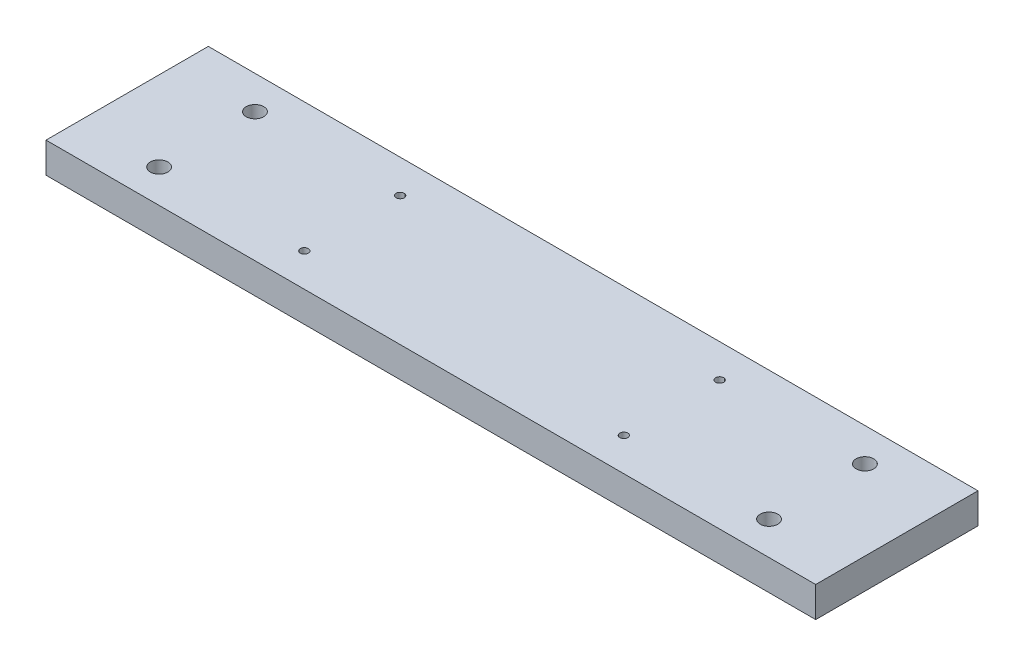
ISO-10303-21;
HEADER;
FILE_DESCRIPTION(('STEP AP214'),'2;1');
FILE_NAME('part.step','',(''),(''),'','','');
FILE_SCHEMA(('AUTOMOTIVE_DESIGN { 1 0 10303 214 1 1 1 1 }'));
ENDSEC;
DATA;
#1=APPLICATION_CONTEXT('core data for automotive mechanical design processes');
#2=APPLICATION_PROTOCOL_DEFINITION('international standard','automotive_design',2000,#1);
#3=PRODUCT_CONTEXT('',#1,'mechanical');
#4=PRODUCT('Part','Part','',(#3));
#5=PRODUCT_RELATED_PRODUCT_CATEGORY('part','',(#4));
#6=PRODUCT_DEFINITION_FORMATION('','',#4);
#7=PRODUCT_DEFINITION_CONTEXT('part definition',#1,'design');
#8=PRODUCT_DEFINITION('design','',#6,#7);
#9=PRODUCT_DEFINITION_SHAPE('','',#8);
#10=(LENGTH_UNIT() NAMED_UNIT(*) SI_UNIT(.MILLI.,.METRE.));
#11=(NAMED_UNIT(*) PLANE_ANGLE_UNIT() SI_UNIT($,.RADIAN.));
#12=(NAMED_UNIT(*) SI_UNIT($,.STERADIAN.) SOLID_ANGLE_UNIT());
#13=UNCERTAINTY_MEASURE_WITH_UNIT(LENGTH_MEASURE(1.E-05),#10,'distance_accuracy_value','');
#14=(GEOMETRIC_REPRESENTATION_CONTEXT(3) GLOBAL_UNCERTAINTY_ASSIGNED_CONTEXT((#13)) GLOBAL_UNIT_ASSIGNED_CONTEXT((#10,
#11,#12)) REPRESENTATION_CONTEXT('',''));
#15=CARTESIAN_POINT('',(0.,0.,0.));
#16=DIRECTION('',(0.,0.,1.));
#17=DIRECTION('',(1.,0.,0.));
#18=AXIS2_PLACEMENT_3D('',#15,#16,#17);
#19=CARTESIAN_POINT('',(120.45,-9.525,-25.4));
#20=DIRECTION('',(1.,0.,0.));
#21=DIRECTION('',(0.,0.,-1.));
#22=AXIS2_PLACEMENT_3D('',#19,#20,#21);
#23=PLANE('',#22);
#24=DIRECTION('',(0.,0.,-1.));
#25=VECTOR('',#24,1.);
#26=CARTESIAN_POINT('',(120.45,0.,-25.4));
#27=LINE('',#26,#25);
#28=CARTESIAN_POINT('',(120.45,0.,25.4));
#29=VERTEX_POINT('',#28);
#30=CARTESIAN_POINT('',(120.45,0.,-25.4));
#31=VERTEX_POINT('',#30);
#32=EDGE_CURVE('E105',#29,#31,#27,.T.);
#33=ORIENTED_EDGE('',*,*,#32,.F.);
#34=DIRECTION('',(0.,1.,0.));
#35=VECTOR('',#34,1.);
#36=CARTESIAN_POINT('',(120.45,-9.525,25.4));
#37=LINE('',#36,#35);
#38=CARTESIAN_POINT('',(120.45,-9.525,25.4));
#39=VERTEX_POINT('',#38);
#40=EDGE_CURVE('E11',#39,#29,#37,.T.);
#41=ORIENTED_EDGE('',*,*,#40,.F.);
#42=DIRECTION('',(0.,0.,-1.));
#43=VECTOR('',#42,1.);
#44=CARTESIAN_POINT('',(120.45,-9.525,-25.4));
#45=LINE('',#44,#43);
#46=CARTESIAN_POINT('',(120.45,-9.525,-25.4));
#47=VERTEX_POINT('',#46);
#48=EDGE_CURVE('E98',#39,#47,#45,.T.);
#49=ORIENTED_EDGE('',*,*,#48,.T.);
#50=DIRECTION('',(0.,1.,0.));
#51=VECTOR('',#50,1.);
#52=CARTESIAN_POINT('',(120.45,-9.525,-25.4));
#53=LINE('',#52,#51);
#54=EDGE_CURVE('E43',#47,#31,#53,.T.);
#55=ORIENTED_EDGE('',*,*,#54,.T.);
#56=EDGE_LOOP('',(#33,#41,#49,#55));
#57=FACE_BOUND('',#56,.T.);
#58=ADVANCED_FACE('F40',(#57),#23,.T.);
#59=CARTESIAN_POINT('',(-120.45,-9.525,25.4));
#60=DIRECTION('',(0.,0.,1.));
#61=DIRECTION('',(1.,0.,0.));
#62=AXIS2_PLACEMENT_3D('',#59,#60,#61);
#63=PLANE('',#62);
#64=DIRECTION('',(1.,0.,0.));
#65=VECTOR('',#64,1.);
#66=CARTESIAN_POINT('',(-120.45,0.,25.4));
#67=LINE('',#66,#65);
#68=CARTESIAN_POINT('',(-120.45,0.,25.4));
#69=VERTEX_POINT('',#68);
#70=EDGE_CURVE('E100',#69,#29,#67,.T.);
#71=ORIENTED_EDGE('',*,*,#70,.F.);
#72=DIRECTION('',(0.,1.,0.));
#73=VECTOR('',#72,1.);
#74=CARTESIAN_POINT('',(-120.45,-9.525,25.4));
#75=LINE('',#74,#73);
#76=CARTESIAN_POINT('',(-120.45,-9.525,25.4));
#77=VERTEX_POINT('',#76);
#78=EDGE_CURVE('E49',#77,#69,#75,.T.);
#79=ORIENTED_EDGE('',*,*,#78,.F.);
#80=DIRECTION('',(1.,0.,0.));
#81=VECTOR('',#80,1.);
#82=CARTESIAN_POINT('',(-120.45,-9.525,25.4));
#83=LINE('',#82,#81);
#84=EDGE_CURVE('E95',#77,#39,#83,.T.);
#85=ORIENTED_EDGE('',*,*,#84,.T.);
#86=ORIENTED_EDGE('',*,*,#40,.T.);
#87=EDGE_LOOP('',(#71,#79,#85,#86));
#88=FACE_BOUND('',#87,.T.);
#89=ADVANCED_FACE('F116',(#88),#63,.T.);
#90=CARTESIAN_POINT('',(-120.45,-9.525,-25.4));
#91=DIRECTION('',(-1.,0.,0.));
#92=DIRECTION('',(0.,0.,1.));
#93=AXIS2_PLACEMENT_3D('',#90,#91,#92);
#94=PLANE('',#93);
#95=DIRECTION('',(0.,0.,1.));
#96=VECTOR('',#95,1.);
#97=CARTESIAN_POINT('',(-120.45,0.,-25.4));
#98=LINE('',#97,#96);
#99=CARTESIAN_POINT('',(-120.45,0.,-25.4));
#100=VERTEX_POINT('',#99);
#101=EDGE_CURVE('E90',#100,#69,#98,.T.);
#102=ORIENTED_EDGE('',*,*,#101,.F.);
#103=DIRECTION('',(0.,1.,0.));
#104=VECTOR('',#103,1.);
#105=CARTESIAN_POINT('',(-120.45,-9.525,-25.4));
#106=LINE('',#105,#104);
#107=CARTESIAN_POINT('',(-120.45,-9.525,-25.4));
#108=VERTEX_POINT('',#107);
#109=EDGE_CURVE('E85',#108,#100,#106,.T.);
#110=ORIENTED_EDGE('',*,*,#109,.F.);
#111=DIRECTION('',(0.,0.,1.));
#112=VECTOR('',#111,1.);
#113=CARTESIAN_POINT('',(-120.45,-9.525,-25.4));
#114=LINE('',#113,#112);
#115=EDGE_CURVE('E88',#108,#77,#114,.T.);
#116=ORIENTED_EDGE('',*,*,#115,.T.);
#117=ORIENTED_EDGE('',*,*,#78,.T.);
#118=EDGE_LOOP('',(#102,#110,#116,#117));
#119=FACE_BOUND('',#118,.T.);
#120=ADVANCED_FACE('F87',(#119),#94,.T.);
#121=CARTESIAN_POINT('',(-120.45,-9.525,-25.4));
#122=DIRECTION('',(0.,0.,-1.));
#123=DIRECTION('',(-1.,0.,0.));
#124=AXIS2_PLACEMENT_3D('',#121,#122,#123);
#125=PLANE('',#124);
#126=DIRECTION('',(-1.,0.,0.));
#127=VECTOR('',#126,1.);
#128=CARTESIAN_POINT('',(-120.45,0.,-25.4));
#129=LINE('',#128,#127);
#130=EDGE_CURVE('E108',#31,#100,#129,.T.);
#131=ORIENTED_EDGE('',*,*,#130,.F.);
#132=ORIENTED_EDGE('',*,*,#54,.F.);
#133=DIRECTION('',(-1.,0.,0.));
#134=VECTOR('',#133,1.);
#135=CARTESIAN_POINT('',(-120.45,-9.525,-25.4));
#136=LINE('',#135,#134);
#137=EDGE_CURVE('E94',#47,#108,#136,.T.);
#138=ORIENTED_EDGE('',*,*,#137,.T.);
#139=ORIENTED_EDGE('',*,*,#109,.T.);
#140=EDGE_LOOP('',(#131,#132,#138,#139));
#141=FACE_BOUND('',#140,.T.);
#142=ADVANCED_FACE('F97',(#141),#125,.T.);
#143=CARTESIAN_POINT('',(0.,-9.525,0.));
#144=DIRECTION('',(0.,1.,0.));
#145=DIRECTION('',(0.,0.,1.));
#146=AXIS2_PLACEMENT_3D('',#143,#144,#145);
#147=PLANE('',#146);
#148=CARTESIAN_POINT('',(-95.45,-9.525,-15.));
#149=DIRECTION('',(0.,1.,0.));
#150=DIRECTION('',(0.,0.,1.));
#151=AXIS2_PLACEMENT_3D('',#148,#149,#150);
#152=CIRCLE('',#151,2.75);
#153=CARTESIAN_POINT('',(-95.45,-9.525,-12.25));
#154=VERTEX_POINT('',#153);
#155=EDGE_CURVE('E173',#154,#154,#152,.T.);
#156=ORIENTED_EDGE('',*,*,#155,.T.);
#157=EDGE_LOOP('',(#156));
#158=FACE_BOUND('',#157,.T.);
#159=CARTESIAN_POINT('',(-95.45,-9.525,15.));
#160=DIRECTION('',(0.,1.,0.));
#161=DIRECTION('',(0.,0.,1.));
#162=AXIS2_PLACEMENT_3D('',#159,#160,#161);
#163=CIRCLE('',#162,2.75);
#164=CARTESIAN_POINT('',(-95.45,-9.525,17.75));
#165=VERTEX_POINT('',#164);
#166=EDGE_CURVE('E185',#165,#165,#163,.T.);
#167=ORIENTED_EDGE('',*,*,#166,.T.);
#168=EDGE_LOOP('',(#167));
#169=FACE_BOUND('',#168,.T.);
#170=CARTESIAN_POINT('',(95.45,-9.525,14.9999999999998));
#171=DIRECTION('',(0.,1.,0.));
#172=DIRECTION('',(0.,0.,1.));
#173=AXIS2_PLACEMENT_3D('',#170,#171,#172);
#174=CIRCLE('',#173,2.75);
#175=CARTESIAN_POINT('',(95.45,-9.525,17.7499999999998));
#176=VERTEX_POINT('',#175);
#177=EDGE_CURVE('E192',#176,#176,#174,.T.);
#178=ORIENTED_EDGE('',*,*,#177,.T.);
#179=EDGE_LOOP('',(#178));
#180=FACE_BOUND('',#179,.T.);
#181=CARTESIAN_POINT('',(95.45,-9.525,-15.0000000000002));
#182=DIRECTION('',(0.,1.,0.));
#183=DIRECTION('',(0.,0.,1.));
#184=AXIS2_PLACEMENT_3D('',#181,#182,#183);
#185=CIRCLE('',#184,2.75);
#186=CARTESIAN_POINT('',(95.45,-9.525,-12.2500000000002));
#187=VERTEX_POINT('',#186);
#188=EDGE_CURVE('E199',#187,#187,#185,.T.);
#189=ORIENTED_EDGE('',*,*,#188,.T.);
#190=EDGE_LOOP('',(#189));
#191=FACE_BOUND('',#190,.T.);
#192=CARTESIAN_POINT('',(-50.,-9.525,-15.));
#193=DIRECTION('',(0.,1.,0.));
#194=DIRECTION('',(0.,0.,1.));
#195=AXIS2_PLACEMENT_3D('',#192,#193,#194);
#196=CIRCLE('',#195,1.25);
#197=CARTESIAN_POINT('',(-50.,-9.525,-13.75));
#198=VERTEX_POINT('',#197);
#199=EDGE_CURVE('E206',#198,#198,#196,.T.);
#200=ORIENTED_EDGE('',*,*,#199,.T.);
#201=EDGE_LOOP('',(#200));
#202=FACE_BOUND('',#201,.T.);
#203=CARTESIAN_POINT('',(-50.,-9.525,15.));
#204=DIRECTION('',(0.,1.,0.));
#205=DIRECTION('',(0.,0.,1.));
#206=AXIS2_PLACEMENT_3D('',#203,#204,#205);
#207=CIRCLE('',#206,1.25);
#208=CARTESIAN_POINT('',(-50.,-9.525,16.25));
#209=VERTEX_POINT('',#208);
#210=EDGE_CURVE('E213',#209,#209,#207,.T.);
#211=ORIENTED_EDGE('',*,*,#210,.T.);
#212=EDGE_LOOP('',(#211));
#213=FACE_BOUND('',#212,.T.);
#214=CARTESIAN_POINT('',(50.,-9.525,15.));
#215=DIRECTION('',(0.,1.,0.));
#216=DIRECTION('',(0.,0.,1.));
#217=AXIS2_PLACEMENT_3D('',#214,#215,#216);
#218=CIRCLE('',#217,1.25);
#219=CARTESIAN_POINT('',(50.,-9.525,16.25));
#220=VERTEX_POINT('',#219);
#221=EDGE_CURVE('E220',#220,#220,#218,.T.);
#222=ORIENTED_EDGE('',*,*,#221,.T.);
#223=EDGE_LOOP('',(#222));
#224=FACE_BOUND('',#223,.T.);
#225=CARTESIAN_POINT('',(50.,-9.525,-15.));
#226=DIRECTION('',(0.,1.,0.));
#227=DIRECTION('',(0.,0.,1.));
#228=AXIS2_PLACEMENT_3D('',#225,#226,#227);
#229=CIRCLE('',#228,1.25);
#230=CARTESIAN_POINT('',(50.,-9.525,-13.75));
#231=VERTEX_POINT('',#230);
#232=EDGE_CURVE('E109',#231,#231,#229,.T.);
#233=ORIENTED_EDGE('',*,*,#232,.T.);
#234=EDGE_LOOP('',(#233));
#235=FACE_BOUND('',#234,.T.);
#236=ORIENTED_EDGE('',*,*,#48,.F.);
#237=ORIENTED_EDGE('',*,*,#84,.F.);
#238=ORIENTED_EDGE('',*,*,#115,.F.);
#239=ORIENTED_EDGE('',*,*,#137,.F.);
#240=EDGE_LOOP('',(#236,#237,#238,#239));
#241=FACE_BOUND('',#240,.T.);
#242=ADVANCED_FACE('F93',(#158,#169,#180,#191,#202,#213,#224,#235,#241),#147,.F.);
#243=CARTESIAN_POINT('',(0.,0.,0.));
#244=DIRECTION('',(0.,1.,0.));
#245=DIRECTION('',(0.,0.,1.));
#246=AXIS2_PLACEMENT_3D('',#243,#244,#245);
#247=PLANE('',#246);
#248=CARTESIAN_POINT('',(-95.45,0.,-15.));
#249=DIRECTION('',(0.,1.,0.));
#250=DIRECTION('',(0.,0.,1.));
#251=AXIS2_PLACEMENT_3D('',#248,#249,#250);
#252=CIRCLE('',#251,2.75);
#253=CARTESIAN_POINT('',(-95.45,0.,-12.25));
#254=VERTEX_POINT('',#253);
#255=EDGE_CURVE('E176',#254,#254,#252,.T.);
#256=ORIENTED_EDGE('',*,*,#255,.F.);
#257=EDGE_LOOP('',(#256));
#258=FACE_BOUND('',#257,.T.);
#259=CARTESIAN_POINT('',(-95.45,0.,15.));
#260=DIRECTION('',(0.,1.,0.));
#261=DIRECTION('',(0.,0.,1.));
#262=AXIS2_PLACEMENT_3D('',#259,#260,#261);
#263=CIRCLE('',#262,2.75);
#264=CARTESIAN_POINT('',(-95.45,0.,17.75));
#265=VERTEX_POINT('',#264);
#266=EDGE_CURVE('E180',#265,#265,#263,.T.);
#267=ORIENTED_EDGE('',*,*,#266,.F.);
#268=EDGE_LOOP('',(#267));
#269=FACE_BOUND('',#268,.T.);
#270=CARTESIAN_POINT('',(95.45,0.,14.9999999999998));
#271=DIRECTION('',(0.,1.,0.));
#272=DIRECTION('',(0.,0.,1.));
#273=AXIS2_PLACEMENT_3D('',#270,#271,#272);
#274=CIRCLE('',#273,2.75);
#275=CARTESIAN_POINT('',(95.45,0.,17.7499999999998));
#276=VERTEX_POINT('',#275);
#277=EDGE_CURVE('E188',#276,#276,#274,.T.);
#278=ORIENTED_EDGE('',*,*,#277,.F.);
#279=EDGE_LOOP('',(#278));
#280=FACE_BOUND('',#279,.T.);
#281=CARTESIAN_POINT('',(95.45,0.,-15.0000000000002));
#282=DIRECTION('',(0.,1.,0.));
#283=DIRECTION('',(0.,0.,1.));
#284=AXIS2_PLACEMENT_3D('',#281,#282,#283);
#285=CIRCLE('',#284,2.75);
#286=CARTESIAN_POINT('',(95.45,0.,-12.2500000000002));
#287=VERTEX_POINT('',#286);
#288=EDGE_CURVE('E195',#287,#287,#285,.T.);
#289=ORIENTED_EDGE('',*,*,#288,.F.);
#290=EDGE_LOOP('',(#289));
#291=FACE_BOUND('',#290,.T.);
#292=CARTESIAN_POINT('',(-50.,0.,-15.));
#293=DIRECTION('',(0.,1.,0.));
#294=DIRECTION('',(0.,0.,1.));
#295=AXIS2_PLACEMENT_3D('',#292,#293,#294);
#296=CIRCLE('',#295,1.24999999999999);
#297=CARTESIAN_POINT('',(-50.,0.,-13.75));
#298=VERTEX_POINT('',#297);
#299=EDGE_CURVE('E202',#298,#298,#296,.T.);
#300=ORIENTED_EDGE('',*,*,#299,.F.);
#301=EDGE_LOOP('',(#300));
#302=FACE_BOUND('',#301,.T.);
#303=CARTESIAN_POINT('',(-50.,0.,15.));
#304=DIRECTION('',(0.,1.,0.));
#305=DIRECTION('',(0.,0.,1.));
#306=AXIS2_PLACEMENT_3D('',#303,#304,#305);
#307=CIRCLE('',#306,1.24999999999999);
#308=CARTESIAN_POINT('',(-50.,0.,16.25));
#309=VERTEX_POINT('',#308);
#310=EDGE_CURVE('E209',#309,#309,#307,.T.);
#311=ORIENTED_EDGE('',*,*,#310,.F.);
#312=EDGE_LOOP('',(#311));
#313=FACE_BOUND('',#312,.T.);
#314=CARTESIAN_POINT('',(50.,0.,15.));
#315=DIRECTION('',(0.,1.,0.));
#316=DIRECTION('',(0.,0.,1.));
#317=AXIS2_PLACEMENT_3D('',#314,#315,#316);
#318=CIRCLE('',#317,1.24999999999999);
#319=CARTESIAN_POINT('',(50.,0.,16.25));
#320=VERTEX_POINT('',#319);
#321=EDGE_CURVE('E216',#320,#320,#318,.T.);
#322=ORIENTED_EDGE('',*,*,#321,.F.);
#323=EDGE_LOOP('',(#322));
#324=FACE_BOUND('',#323,.T.);
#325=CARTESIAN_POINT('',(50.,0.,-15.));
#326=DIRECTION('',(0.,1.,0.));
#327=DIRECTION('',(0.,0.,1.));
#328=AXIS2_PLACEMENT_3D('',#325,#326,#327);
#329=CIRCLE('',#328,1.24999999999999);
#330=CARTESIAN_POINT('',(50.,0.,-13.75));
#331=VERTEX_POINT('',#330);
#332=EDGE_CURVE('E223',#331,#331,#329,.T.);
#333=ORIENTED_EDGE('',*,*,#332,.F.);
#334=EDGE_LOOP('',(#333));
#335=FACE_BOUND('',#334,.T.);
#336=ORIENTED_EDGE('',*,*,#32,.T.);
#337=ORIENTED_EDGE('',*,*,#130,.T.);
#338=ORIENTED_EDGE('',*,*,#101,.T.);
#339=ORIENTED_EDGE('',*,*,#70,.T.);
#340=EDGE_LOOP('',(#336,#337,#338,#339));
#341=FACE_BOUND('',#340,.T.);
#342=ADVANCED_FACE('F115',(#258,#269,#280,#291,#302,#313,#324,#335,#341),#247,.T.);
#343=CARTESIAN_POINT('',(50.,0.,-15.));
#344=DIRECTION('',(0.,1.,0.));
#345=DIRECTION('',(0.,0.,1.));
#346=AXIS2_PLACEMENT_3D('',#343,#344,#345);
#347=CYLINDRICAL_SURFACE('',#346,1.24999999999999);
#348=ORIENTED_EDGE('',*,*,#232,.F.);
#349=EDGE_LOOP('',(#348));
#350=FACE_BOUND('',#349,.T.);
#351=ORIENTED_EDGE('',*,*,#332,.T.);
#352=EDGE_LOOP('',(#351));
#353=FACE_BOUND('',#352,.T.);
#354=ADVANCED_FACE('F134',(#350,#353),#347,.F.);
#355=CARTESIAN_POINT('',(50.,0.,15.));
#356=DIRECTION('',(0.,1.,0.));
#357=DIRECTION('',(0.,0.,1.));
#358=AXIS2_PLACEMENT_3D('',#355,#356,#357);
#359=CYLINDRICAL_SURFACE('',#358,1.24999999999999);
#360=ORIENTED_EDGE('',*,*,#221,.F.);
#361=EDGE_LOOP('',(#360));
#362=FACE_BOUND('',#361,.T.);
#363=ORIENTED_EDGE('',*,*,#321,.T.);
#364=EDGE_LOOP('',(#363));
#365=FACE_BOUND('',#364,.T.);
#366=ADVANCED_FACE('F141',(#362,#365),#359,.F.);
#367=CARTESIAN_POINT('',(-50.,0.,15.));
#368=DIRECTION('',(0.,1.,0.));
#369=DIRECTION('',(0.,0.,1.));
#370=AXIS2_PLACEMENT_3D('',#367,#368,#369);
#371=CYLINDRICAL_SURFACE('',#370,1.24999999999999);
#372=ORIENTED_EDGE('',*,*,#210,.F.);
#373=EDGE_LOOP('',(#372));
#374=FACE_BOUND('',#373,.T.);
#375=ORIENTED_EDGE('',*,*,#310,.T.);
#376=EDGE_LOOP('',(#375));
#377=FACE_BOUND('',#376,.T.);
#378=ADVANCED_FACE('F145',(#374,#377),#371,.F.);
#379=CARTESIAN_POINT('',(-50.,0.,-15.));
#380=DIRECTION('',(0.,1.,0.));
#381=DIRECTION('',(0.,0.,1.));
#382=AXIS2_PLACEMENT_3D('',#379,#380,#381);
#383=CYLINDRICAL_SURFACE('',#382,1.24999999999999);
#384=ORIENTED_EDGE('',*,*,#199,.F.);
#385=EDGE_LOOP('',(#384));
#386=FACE_BOUND('',#385,.T.);
#387=ORIENTED_EDGE('',*,*,#299,.T.);
#388=EDGE_LOOP('',(#387));
#389=FACE_BOUND('',#388,.T.);
#390=ADVANCED_FACE('F149',(#386,#389),#383,.F.);
#391=CARTESIAN_POINT('',(95.45,0.,-15.0000000000002));
#392=DIRECTION('',(0.,1.,0.));
#393=DIRECTION('',(0.,0.,1.));
#394=AXIS2_PLACEMENT_3D('',#391,#392,#393);
#395=CYLINDRICAL_SURFACE('',#394,2.75);
#396=ORIENTED_EDGE('',*,*,#188,.F.);
#397=EDGE_LOOP('',(#396));
#398=FACE_BOUND('',#397,.T.);
#399=ORIENTED_EDGE('',*,*,#288,.T.);
#400=EDGE_LOOP('',(#399));
#401=FACE_BOUND('',#400,.T.);
#402=ADVANCED_FACE('F153',(#398,#401),#395,.F.);
#403=CARTESIAN_POINT('',(95.45,0.,14.9999999999998));
#404=DIRECTION('',(0.,1.,0.));
#405=DIRECTION('',(0.,0.,1.));
#406=AXIS2_PLACEMENT_3D('',#403,#404,#405);
#407=CYLINDRICAL_SURFACE('',#406,2.75);
#408=ORIENTED_EDGE('',*,*,#177,.F.);
#409=EDGE_LOOP('',(#408));
#410=FACE_BOUND('',#409,.T.);
#411=ORIENTED_EDGE('',*,*,#277,.T.);
#412=EDGE_LOOP('',(#411));
#413=FACE_BOUND('',#412,.T.);
#414=ADVANCED_FACE('F157',(#410,#413),#407,.F.);
#415=CARTESIAN_POINT('',(-95.45,0.,15.));
#416=DIRECTION('',(0.,1.,0.));
#417=DIRECTION('',(0.,0.,1.));
#418=AXIS2_PLACEMENT_3D('',#415,#416,#417);
#419=CYLINDRICAL_SURFACE('',#418,2.75);
#420=ORIENTED_EDGE('',*,*,#166,.F.);
#421=EDGE_LOOP('',(#420));
#422=FACE_BOUND('',#421,.T.);
#423=ORIENTED_EDGE('',*,*,#266,.T.);
#424=EDGE_LOOP('',(#423));
#425=FACE_BOUND('',#424,.T.);
#426=ADVANCED_FACE('F161',(#422,#425),#419,.F.);
#427=CARTESIAN_POINT('',(-95.45,0.,-15.));
#428=DIRECTION('',(0.,1.,0.));
#429=DIRECTION('',(0.,0.,1.));
#430=AXIS2_PLACEMENT_3D('',#427,#428,#429);
#431=CYLINDRICAL_SURFACE('',#430,2.75);
#432=ORIENTED_EDGE('',*,*,#155,.F.);
#433=EDGE_LOOP('',(#432));
#434=FACE_BOUND('',#433,.T.);
#435=ORIENTED_EDGE('',*,*,#255,.T.);
#436=EDGE_LOOP('',(#435));
#437=FACE_BOUND('',#436,.T.);
#438=ADVANCED_FACE('F165',(#434,#437),#431,.F.);
#439=CLOSED_SHELL('',(#58,#89,#120,#142,#242,#342,#354,#366,#378,#390,#402,#414,#426,#438));
#440=MANIFOLD_SOLID_BREP('B2',#439);
#441=ADVANCED_BREP_SHAPE_REPRESENTATION('',(#18,#440),#14);
#442=SHAPE_DEFINITION_REPRESENTATION(#9,#441);
ENDSEC;
END-ISO-10303-21;
